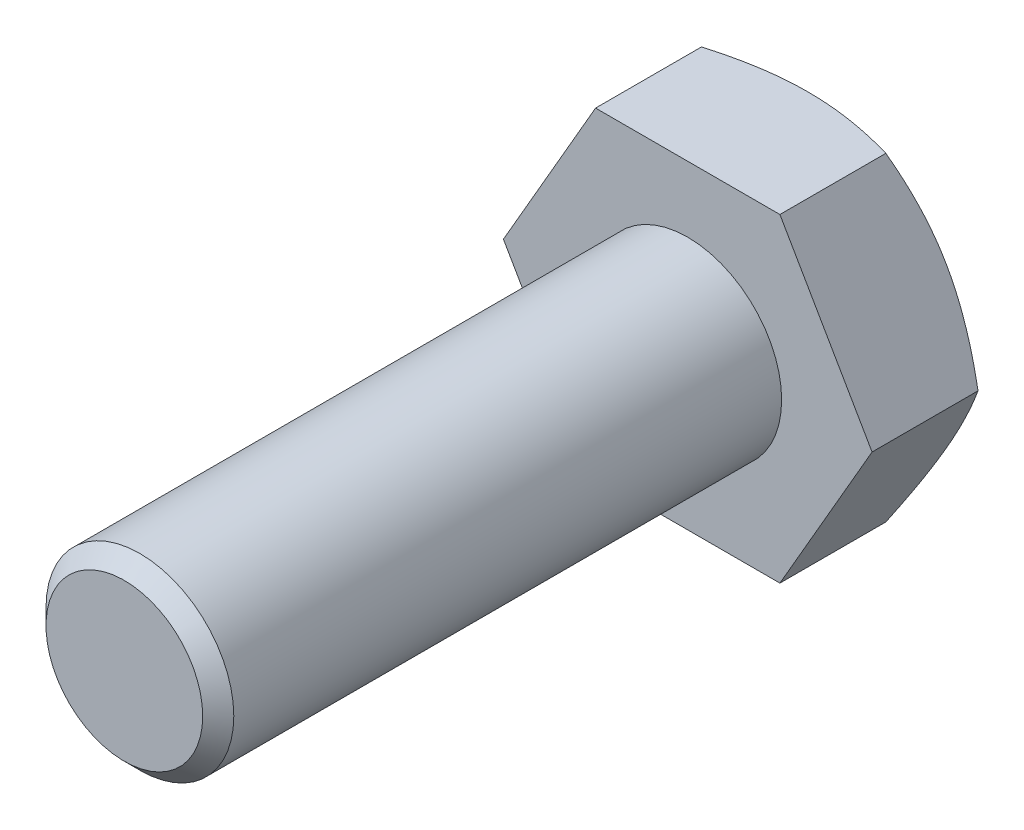
ISO-10303-21;
HEADER;
FILE_DESCRIPTION(('STEP AP214'),'2;1');
FILE_NAME('part.step','',(''),(''),'','','');
FILE_SCHEMA(('AUTOMOTIVE_DESIGN { 1 0 10303 214 1 1 1 1 }'));
ENDSEC;
DATA;
#1=APPLICATION_CONTEXT('core data for automotive mechanical design processes');
#2=APPLICATION_PROTOCOL_DEFINITION('international standard','automotive_design',2000,#1);
#3=PRODUCT_CONTEXT('',#1,'mechanical');
#4=PRODUCT('Part','Part','',(#3));
#5=PRODUCT_RELATED_PRODUCT_CATEGORY('part','',(#4));
#6=PRODUCT_DEFINITION_FORMATION('','',#4);
#7=PRODUCT_DEFINITION_CONTEXT('part definition',#1,'design');
#8=PRODUCT_DEFINITION('design','',#6,#7);
#9=PRODUCT_DEFINITION_SHAPE('','',#8);
#10=(LENGTH_UNIT() NAMED_UNIT(*) SI_UNIT(.MILLI.,.METRE.));
#11=(NAMED_UNIT(*) PLANE_ANGLE_UNIT() SI_UNIT($,.RADIAN.));
#12=(NAMED_UNIT(*) SI_UNIT($,.STERADIAN.) SOLID_ANGLE_UNIT());
#13=UNCERTAINTY_MEASURE_WITH_UNIT(LENGTH_MEASURE(1.E-05),#10,'distance_accuracy_value','');
#14=(GEOMETRIC_REPRESENTATION_CONTEXT(3) GLOBAL_UNCERTAINTY_ASSIGNED_CONTEXT((#13)) GLOBAL_UNIT_ASSIGNED_CONTEXT((#10,
#11,#12)) REPRESENTATION_CONTEXT('',''));
#15=CARTESIAN_POINT('',(0.,0.,0.));
#16=DIRECTION('',(0.,0.,1.));
#17=DIRECTION('',(1.,0.,0.));
#18=AXIS2_PLACEMENT_3D('',#15,#16,#17);
#19=CARTESIAN_POINT('',(4.90747728811212,8.50000000000016,6.40000000000099));
#20=DIRECTION('',(0.,-1.,0.));
#21=DIRECTION('',(1.,0.,0.));
#22=AXIS2_PLACEMENT_3D('',#19,#20,#21);
#23=PLANE('',#22);
#24=CARTESIAN_POINT('',(-13.1507760236535,8.50000000000042,4.13304094969343));
#25=CARTESIAN_POINT('',(-12.779793237213,8.50000000000025,3.9532071543903));
#26=CARTESIAN_POINT('',(-12.4079554817184,8.50000000000018,3.77510673530734));
#27=CARTESIAN_POINT('',(-11.6621152399988,8.50000000000014,3.42334814772755));
#28=CARTESIAN_POINT('',(-11.2881124210353,8.50000000000015,3.2496906855383));
#29=CARTESIAN_POINT('',(-10.5355451575032,8.50000000000017,2.90691310544452));
#30=CARTESIAN_POINT('',(-10.1569669433867,8.50000000000016,2.73782311333024));
#31=CARTESIAN_POINT('',(-9.39678859586902,8.50000000000016,2.40660460259513));
#32=CARTESIAN_POINT('',(-9.01518860718188,8.50000000000016,2.24447575296187));
#33=CARTESIAN_POINT('',(-8.23614945571322,8.50000000000016,1.92399544121883));
#34=CARTESIAN_POINT('',(-7.83859266315971,8.50000000000016,1.76592832975846));
#35=CARTESIAN_POINT('',(-7.03881729879112,8.50000000000016,1.46183316038925));
#36=CARTESIAN_POINT('',(-6.63659820785256,8.50000000000015,1.31580645809512));
#37=CARTESIAN_POINT('',(-5.82761654834246,8.50000000000017,1.03964910609802));
#38=CARTESIAN_POINT('',(-5.42086517952549,8.50000000000019,0.909486001850074));
#39=CARTESIAN_POINT('',(-4.60154260721254,8.50000000000012,0.669251504508218));
#40=CARTESIAN_POINT('',(-4.18897329126147,8.50000000000003,0.559173749551001));
#41=CARTESIAN_POINT('',(-3.36000334553182,8.50000000000004,0.365006336760554));
#42=CARTESIAN_POINT('',(-2.94363646849485,8.50000000000014,0.280776482057557));
#43=CARTESIAN_POINT('',(-2.31531966597736,8.50000000000017,0.177478094427576));
#44=CARTESIAN_POINT('',(-2.10523727732992,8.50000000000016,0.146884951462742));
#45=CARTESIAN_POINT('',(-1.68403896198439,8.50000000000016,0.0939815793612819));
#46=CARTESIAN_POINT('',(-1.47292313697842,8.50000000000016,0.0716705512133057));
#47=CARTESIAN_POINT('',(-1.05268457078276,8.50000000000016,0.0360540633783739));
#48=CARTESIAN_POINT('',(-0.84357143617689,8.50000000000016,0.022635693205803));
#49=CARTESIAN_POINT('',(-0.424965279960819,8.50000000000016,0.00465177528142398));
#50=CARTESIAN_POINT('',(-0.215472264664717,8.50000000000015,8.60817126390969E-05));
#51=CARTESIAN_POINT('',(0.203519347575902,8.50000000000017,-8.36556145530409E-05));
#52=CARTESIAN_POINT('',(0.413017944536883,8.50000000000019,0.00431233089848065));
#53=CARTESIAN_POINT('',(0.831644580776046,8.50000000000013,0.02195904630707));
#54=CARTESIAN_POINT('',(1.04077260074798,8.50000000000004,0.0352102236852546));
#55=CARTESIAN_POINT('',(1.54433660129013,8.5,0.0775002478253111));
#56=CARTESIAN_POINT('',(1.83842266660663,8.50000000000012,0.110794226410689));
#57=CARTESIAN_POINT('',(2.42437752012375,8.50000000000021,0.193069728584259));
#58=CARTESIAN_POINT('',(2.71624599731337,8.50000000000018,0.242053412505373));
#59=CARTESIAN_POINT('',(3.58821174297491,8.50000000000013,0.409938673399742));
#60=CARTESIAN_POINT('',(4.16433582674671,8.50000000000015,0.549742776936651));
#61=CARTESIAN_POINT('',(5.02572621394302,8.50000000000016,0.791736186856428));
#62=CARTESIAN_POINT('',(5.31547200535638,8.50000000000016,0.878893904538782));
#63=CARTESIAN_POINT('',(5.89214876364307,8.50000000000016,1.06215372096539));
#64=CARTESIAN_POINT('',(6.17907971225216,8.50000000000015,1.15825587770373));
#65=CARTESIAN_POINT('',(6.75021885398892,8.50000000000017,1.35787170131869));
#66=CARTESIAN_POINT('',(7.03442793558404,8.5000000000002,1.46138284929851));
#67=CARTESIAN_POINT('',(7.60049895914593,8.50000000000012,1.67460958247361));
#68=CARTESIAN_POINT('',(7.88236092581713,8.50000000000001,1.78432510227016));
#69=CARTESIAN_POINT('',(8.53585485546573,8.49999999999997,2.04566292007363));
#70=CARTESIAN_POINT('',(8.90669736291769,8.50000000000011,2.19925537736368));
#71=CARTESIAN_POINT('',(9.64531700349557,8.50000000000021,2.51366253411151));
#72=CARTESIAN_POINT('',(10.0130939638709,8.50000000000017,2.67447763736312));
#73=CARTESIAN_POINT('',(10.7461373790236,8.50000000000015,3.00191683409719));
#74=CARTESIAN_POINT('',(11.1114032983348,8.50000000000016,3.16854212322047));
#75=CARTESIAN_POINT('',(11.8397572222066,8.50000000000016,3.50645750747021));
#76=CARTESIAN_POINT('',(12.2028452686524,8.50000000000016,3.67774751253077));
#77=CARTESIAN_POINT('',(12.927570379847,8.50000000000016,4.02431621359802));
#78=CARTESIAN_POINT('',(13.2892055596489,8.50000000000016,4.19959884488746));
#79=CARTESIAN_POINT('',(14.0109318084844,8.50000000000016,4.55331757801335));
#80=CARTESIAN_POINT('',(14.3710228640548,8.50000000000016,4.73175370727584));
#81=CARTESIAN_POINT('',(15.4492515635062,8.50000000000016,5.27092611522304));
#82=CARTESIAN_POINT('',(16.1654350708762,8.50000000000016,5.6355699588705));
#83=CARTESIAN_POINT('',(17.5359569733251,8.50000000000016,6.34231107414496));
#84=CARTESIAN_POINT('',(18.1905930939243,8.50000000000016,6.68383353397369));
#85=CARTESIAN_POINT('',(19.4974088780933,8.50000000000016,7.37159446346647));
#86=CARTESIAN_POINT('',(20.1495884604161,8.50000000000016,7.71783308739354));
#87=CARTESIAN_POINT('',(21.4504717343125,8.50000000000017,8.41308553818056));
#88=CARTESIAN_POINT('',(22.0991800029719,8.50000000000018,8.76209081453515));
#89=CARTESIAN_POINT('',(23.3950185512495,8.50000000000015,9.46293857235101));
#90=CARTESIAN_POINT('',(24.0421489123185,8.50000000000011,9.81478090314648));
#91=CARTESIAN_POINT('',(24.6886951007935,8.50000000000001,10.1676862353782));
#92=B_SPLINE_CURVE_WITH_KNOTS('',3,(#24,#25,#26,#27,#28,#29,#30,#31,#32,#33,#34,#35,#36,#37,#38,
#39,#40,#41,#42,#43,#44,#45,#46,#47,#48,#49,#50,#51,#52,#53,#54,#55,#56,#57,#58,#59,#60,#61,#62,
#63,#64,#65,#66,#67,#68,#69,#70,#71,#72,#73,#74,#75,#76,#77,#78,#79,#80,#81,#82,#83,#84,#85,#86,
#87,#88,#89,#90,#91),.UNSPECIFIED.,.F.,.F.,(4,2,2,2,2,2,2,2,2,2,2,2,2,2,2,2,2,2,2,2,2,2,2,2,2,2,
2,2,2,2,2,2,2,4),(0.,1.23683205087273,2.47385951733026,3.71767475462567,4.96143078104728,
6.24476283372291,7.52823917842106,8.80904400127764,10.0894424332076,11.3627680683901,
11.9995252601113,12.6362210051439,13.2646692746335,13.8931071925414,14.521547233238,
15.1500191045082,16.0374110463139,16.9249252266627,18.7009540866881,19.608592151724,
20.5162361021263,21.4235729256431,22.33090018693,23.534971677628,24.7391105679074,
25.943498729742,27.1478636538281,28.3534719402871,29.5590907171106,31.9700274677016,
34.185108342642,36.4002618464375,38.6101511553736,40.8199238679679),.UNSPECIFIED.);
#93=CARTESIAN_POINT('',(-4.90747728811173,8.50000000000008,0.759189378557144));
#94=VERTEX_POINT('',#93);
#95=CARTESIAN_POINT('',(6.76542155630955E-13,8.49999999999981,-2.35922392732846E-13));
#96=VERTEX_POINT('',#95);
#97=EDGE_CURVE('E65',#94,#96,#92,.T.);
#98=ORIENTED_EDGE('',*,*,#97,.F.);
#99=DIRECTION('',(0.,0.,-1.));
#100=VECTOR('',#99,1.);
#101=CARTESIAN_POINT('',(-4.90747728811163,8.5000000000003,6.40000000000229));
#102=LINE('',#101,#100);
#103=CARTESIAN_POINT('',(-4.90747728811163,8.5000000000003,6.40000000000229));
#104=VERTEX_POINT('',#103);
#105=EDGE_CURVE('E164',#104,#94,#102,.T.);
#106=ORIENTED_EDGE('',*,*,#105,.F.);
#107=DIRECTION('',(-1.,0.,0.));
#108=VECTOR('',#107,1.);
#109=CARTESIAN_POINT('',(4.90747728811212,8.50000000000016,6.40000000000099));
#110=LINE('',#109,#108);
#111=CARTESIAN_POINT('',(4.90747728811212,8.50000000000016,6.40000000000099));
#112=VERTEX_POINT('',#111);
#113=EDGE_CURVE('E262',#112,#104,#110,.T.);
#114=ORIENTED_EDGE('',*,*,#113,.F.);
#115=DIRECTION('',(0.,0.,-1.));
#116=VECTOR('',#115,1.);
#117=CARTESIAN_POINT('',(4.90747728811212,8.50000000000016,6.40000000000099));
#118=LINE('',#117,#116);
#119=CARTESIAN_POINT('',(4.90747728811194,8.50000000000005,0.75918937855584));
#120=VERTEX_POINT('',#119);
#121=EDGE_CURVE('E151',#112,#120,#118,.T.);
#122=ORIENTED_EDGE('',*,*,#121,.T.);
#123=EDGE_CURVE('E145',#96,#120,#92,.T.);
#124=ORIENTED_EDGE('',*,*,#123,.F.);
#125=EDGE_LOOP('',(#98,#106,#114,#122,#124));
#126=FACE_BOUND('',#125,.T.);
#127=ADVANCED_FACE('F50',(#126),#23,.F.);
#128=CARTESIAN_POINT('',(-4.90747728811163,8.5000000000003,6.40000000000229));
#129=DIRECTION('',(0.866025403784439,-0.5,0.));
#130=DIRECTION('',(0.5,0.866025403784439,0.));
#131=AXIS2_PLACEMENT_3D('',#128,#129,#130);
#132=PLANE('',#131);
#133=CARTESIAN_POINT('',(-9.81507004627735,-0.000199999999977996,0.759256046397982));
#134=CARTESIAN_POINT('',(-9.70719836791424,0.186639227622768,0.696986139248973));
#135=CARTESIAN_POINT('',(-9.59892450580097,0.374175057934708,0.6375422957474));
#136=CARTESIAN_POINT('',(-9.38149745632211,0.750769754571919,0.52508511076032));
#137=CARTESIAN_POINT('',(-9.27234391091486,0.939829241043536,0.472074544983142));
#138=CARTESIAN_POINT('',(-8.94313560188241,1.51003475856155,0.323733389730519));
#139=CARTESIAN_POINT('',(-8.72178130831629,1.8934316414916,0.239358927937871));
#140=CARTESIAN_POINT('',(-8.39052888726984,2.46717766487425,0.140420015694828));
#141=CARTESIAN_POINT('',(-8.28162036184627,2.65581276428527,0.112235199448259));
#142=CARTESIAN_POINT('',(-8.06331079760512,3.03393602132919,0.0649740847663061));
#143=CARTESIAN_POINT('',(-7.95390980316582,3.22342410209662,0.0458969815531207));
#144=CARTESIAN_POINT('',(-7.73491944569814,3.60272652759828,0.0173347726658145));
#145=CARTESIAN_POINT('',(-7.62533043846194,3.79254025608237,0.00783878147114015));
#146=CARTESIAN_POINT('',(-7.4060511905215,4.17234305456082,-0.00135762036058392));
#147=CARTESIAN_POINT('',(-7.29636095304958,4.36233211895666,-0.00105833363161793));
#148=CARTESIAN_POINT('',(-7.09129139581003,4.7175230111812,0.00865447557452116));
#149=CARTESIAN_POINT('',(-6.9958976040627,4.88274990521406,0.0168831685979087));
#150=CARTESIAN_POINT('',(-6.80533344342264,5.21281671354424,0.0405892410567572));
#151=CARTESIAN_POINT('',(-6.7101630900253,5.37765660100275,0.0560671091188197));
#152=CARTESIAN_POINT('',(-6.4250204732264,5.87153810070166,0.113008620858951));
#153=CARTESIAN_POINT('',(-6.23555293555783,6.19970550232856,0.164973061277844));
#154=CARTESIAN_POINT('',(-5.85460803351865,6.85952142754474,0.29488494052299));
#155=CARTESIAN_POINT('',(-5.66317928714386,7.1910857422951,0.373383069871971));
#156=CARTESIAN_POINT('',(-5.28317649029198,7.84926989346085,0.551541339973035));
#157=CARTESIAN_POINT('',(-5.0945975735863,8.1758981584314,0.651159636130974));
#158=CARTESIAN_POINT('',(-4.90736181805794,8.50020000000008,0.759256046400265));
#159=B_SPLINE_CURVE_WITH_KNOTS('',3,(#133,#134,#135,#136,#137,#138,#139,#140,#141,#142,#143,
#144,#145,#146,#147,#148,#149,#150,#151,#152,#153,#154,#155,#156,#157,#158),.UNSPECIFIED.,.F.,
.F.,(4,2,2,2,2,2,2,2,2,2,2,2,4),(0.,0.673596396411569,1.34748239783853,2.69805431639328,
3.356799954547,4.01548737369112,4.67342558367778,5.33134346608664,5.90409556798859,
6.47688628148388,7.62328361419594,8.79510569878617,9.96462743748781),.UNSPECIFIED.);
#160=CARTESIAN_POINT('',(-9.81495457622353,1.2490009027033E-13,0.759189378554861));
#161=VERTEX_POINT('',#160);
#162=CARTESIAN_POINT('',(-7.36121593216766,4.25000000000007,1.06165076729781E-12));
#163=VERTEX_POINT('',#162);
#164=EDGE_CURVE('E73',#161,#163,#159,.T.);
#165=ORIENTED_EDGE('',*,*,#164,.F.);
#166=DIRECTION('',(0.,0.,-1.));
#167=VECTOR('',#166,1.);
#168=CARTESIAN_POINT('',(-9.81495457622254,1.04083408558608E-12,6.40000000000001));
#169=LINE('',#168,#167);
#170=CARTESIAN_POINT('',(-9.81495457622254,1.04083408558608E-12,6.40000000000001));
#171=VERTEX_POINT('',#170);
#172=EDGE_CURVE('E161',#171,#161,#169,.T.);
#173=ORIENTED_EDGE('',*,*,#172,.F.);
#174=DIRECTION('',(-0.5,-0.866025403784439,0.));
#175=VECTOR('',#174,1.);
#176=CARTESIAN_POINT('',(-4.90747728811163,8.5000000000003,6.40000000000229));
#177=LINE('',#176,#175);
#178=EDGE_CURVE('E257',#104,#171,#177,.T.);
#179=ORIENTED_EDGE('',*,*,#178,.F.);
#180=ORIENTED_EDGE('',*,*,#105,.T.);
#181=EDGE_CURVE('E199',#163,#94,#159,.T.);
#182=ORIENTED_EDGE('',*,*,#181,.F.);
#183=EDGE_LOOP('',(#165,#173,#179,#180,#182));
#184=FACE_BOUND('',#183,.T.);
#185=ADVANCED_FACE('F241',(#184),#132,.F.);
#186=CARTESIAN_POINT('',(-9.81495457622254,1.04083408558608E-12,6.40000000000001));
#187=DIRECTION('',(0.866025403784439,0.5,0.));
#188=DIRECTION('',(-0.5,0.866025403784439,0.));
#189=AXIS2_PLACEMENT_3D('',#186,#187,#188);
#190=PLANE('',#189);
#191=CARTESIAN_POINT('',(-4.90736181805806,-8.50020000000003,0.759256046396678));
#192=CARTESIAN_POINT('',(-5.0152334964204,-8.31336077237677,0.696986139247987));
#193=CARTESIAN_POINT('',(-5.12350735853333,-8.12582494206463,0.63754229574655));
#194=CARTESIAN_POINT('',(-5.34093440801192,-7.74923024542729,0.525085110759573));
#195=CARTESIAN_POINT('',(-5.45008795341923,-7.56017075895575,0.472074544982361));
#196=CARTESIAN_POINT('',(-5.77929626245179,-6.98996524143787,0.323733389729677));
#197=CARTESIAN_POINT('',(-6.00065055601784,-6.6065683585078,0.239358927937049));
#198=CARTESIAN_POINT('',(-6.33190297706423,-6.03282233512513,0.140420015694009));
#199=CARTESIAN_POINT('',(-6.44081150248778,-5.84418723571411,0.112235199447437));
#200=CARTESIAN_POINT('',(-6.659121066729,-5.46606397867023,0.0649740847654669));
#201=CARTESIAN_POINT('',(-6.76852206116836,-5.27657589790284,0.0458969815522681));
#202=CARTESIAN_POINT('',(-6.98751241863584,-4.89727347240108,0.0173347726649909));
#203=CARTESIAN_POINT('',(-7.09710142587176,-4.70745974391684,0.00783878147035882));
#204=CARTESIAN_POINT('',(-7.31638067381293,-4.32765694543884,-0.00135762036148689));
#205=CARTESIAN_POINT('',(-7.42607091128587,-4.1376678810436,-0.00105833363268497));
#206=CARTESIAN_POINT('',(-7.63114046852526,-3.782476988819,0.00865447557347719));
#207=CARTESIAN_POINT('',(-7.72653426027168,-3.61725009478563,0.0168831685970092));
#208=CARTESIAN_POINT('',(-7.91709842091104,-3.28718328645507,0.0405892410559698));
#209=CARTESIAN_POINT('',(-8.0122687743086,-3.12234339899669,0.0560671091180001));
#210=CARTESIAN_POINT('',(-8.29741139110786,-2.628461899298,0.113008620858069));
#211=CARTESIAN_POINT('',(-8.48687892877629,-2.30029449767101,0.164973061276965));
#212=CARTESIAN_POINT('',(-8.86782383081525,-1.64047857245475,0.294884940522219));
#213=CARTESIAN_POINT('',(-9.05925257718998,-1.3089142577044,0.373383069871305));
#214=CARTESIAN_POINT('',(-9.43925537404215,-0.650730106538796,0.551541339972081));
#215=CARTESIAN_POINT('',(-9.62783429074818,-0.324101841568382,0.651159636129626));
#216=CARTESIAN_POINT('',(-9.81507004627729,0.000200000000102896,0.759256046397982));
#217=B_SPLINE_CURVE_WITH_KNOTS('',3,(#191,#192,#193,#194,#195,#196,#197,#198,#199,#200,#201,
#202,#203,#204,#205,#206,#207,#208,#209,#210,#211,#212,#213,#214,#215,#216),.UNSPECIFIED.,.F.,
.F.,(4,2,2,2,2,2,2,2,2,2,2,2,4),(0.,0.673596396411488,1.34748239783838,2.69805431639306,
3.35679995454677,4.01548737369089,4.67342558367751,5.33134346608634,5.90409556798826,
6.47688628148353,7.62328361419559,8.79510569878577,9.96462743748729),.UNSPECIFIED.);
#218=CARTESIAN_POINT('',(-4.90747728811185,-8.49999999999997,0.759189378553557));
#219=VERTEX_POINT('',#218);
#220=CARTESIAN_POINT('',(-7.36121593216775,-4.24999999999999,-2.28289609438548E-12));
#221=VERTEX_POINT('',#220);
#222=EDGE_CURVE('E197',#219,#221,#217,.T.);
#223=ORIENTED_EDGE('',*,*,#222,.F.);
#224=DIRECTION('',(0.,0.,-1.));
#225=VECTOR('',#224,1.);
#226=CARTESIAN_POINT('',(-4.90747728811145,-8.49999999999985,6.39999999999871));
#227=LINE('',#226,#225);
#228=CARTESIAN_POINT('',(-4.90747728811145,-8.49999999999985,6.39999999999871));
#229=VERTEX_POINT('',#228);
#230=EDGE_CURVE('E153',#229,#219,#227,.T.);
#231=ORIENTED_EDGE('',*,*,#230,.F.);
#232=DIRECTION('',(0.5,-0.866025403784439,0.));
#233=VECTOR('',#232,1.);
#234=CARTESIAN_POINT('',(-9.81495457622254,1.04083408558608E-12,6.40000000000001));
#235=LINE('',#234,#233);
#236=EDGE_CURVE('E261',#171,#229,#235,.T.);
#237=ORIENTED_EDGE('',*,*,#236,.F.);
#238=ORIENTED_EDGE('',*,*,#172,.T.);
#239=EDGE_CURVE('E195',#221,#161,#217,.T.);
#240=ORIENTED_EDGE('',*,*,#239,.F.);
#241=EDGE_LOOP('',(#223,#231,#237,#238,#240));
#242=FACE_BOUND('',#241,.T.);
#243=ADVANCED_FACE('F244',(#242),#190,.F.);
#244=CARTESIAN_POINT('',(-4.90747728811145,-8.49999999999985,6.39999999999871));
#245=DIRECTION('',(0.,1.,0.));
#246=DIRECTION('',(0.,0.,1.));
#247=AXIS2_PLACEMENT_3D('',#244,#245,#246);
#248=PLANE('',#247);
#249=CARTESIAN_POINT('',(-13.1507760236543,-8.49999999999936,4.13304094969467));
#250=CARTESIAN_POINT('',(-12.7797932372139,-8.49999999999968,3.95320715439099));
#251=CARTESIAN_POINT('',(-12.4079554817194,-8.49999999999981,3.77510673530777));
#252=CARTESIAN_POINT('',(-11.6621152399996,-8.4999999999999,3.4233481477277));
#253=CARTESIAN_POINT('',(-11.2881124210359,-8.49999999999987,3.24969068553842));
#254=CARTESIAN_POINT('',(-10.5355451575034,-8.49999999999984,2.9069131054445));
#255=CARTESIAN_POINT('',(-10.1569669433866,-8.49999999999985,2.73782311333009));
#256=CARTESIAN_POINT('',(-9.39678859586843,-8.49999999999986,2.40660460259475));
#257=CARTESIAN_POINT('',(-9.01518860718106,-8.49999999999986,2.24447575296138));
#258=CARTESIAN_POINT('',(-8.23614945571216,-8.49999999999985,1.9239954412183));
#259=CARTESIAN_POINT('',(-7.83859266315865,-8.49999999999985,1.76592832975798));
#260=CARTESIAN_POINT('',(-7.03881729879006,-8.49999999999986,1.46183316038866));
#261=CARTESIAN_POINT('',(-6.63659820785151,-8.49999999999987,1.31580645809436));
#262=CARTESIAN_POINT('',(-5.82761654834131,-8.49999999999984,1.03964910609775));
#263=CARTESIAN_POINT('',(-5.42086517952422,-8.49999999999981,0.909486001850435));
#264=CARTESIAN_POINT('',(-4.60154260721184,-8.4999999999999,0.66925150450698));
#265=CARTESIAN_POINT('',(-4.18897329126146,-8.50000000000003,0.559173749547522));
#266=CARTESIAN_POINT('',(-3.36000334553208,-8.50000000000002,0.36500633675733));
#267=CARTESIAN_POINT('',(-2.94363646849471,-8.49999999999988,0.2807764820568));
#268=CARTESIAN_POINT('',(-2.31531966597719,-8.49999999999984,0.177478094427663));
#269=CARTESIAN_POINT('',(-2.10523727732982,-8.49999999999985,0.146884951462633));
#270=CARTESIAN_POINT('',(-1.6840389619844,-8.49999999999986,0.0939815793610365));
#271=CARTESIAN_POINT('',(-1.47292313697847,-8.49999999999986,0.07167055121312));
#272=CARTESIAN_POINT('',(-1.05268457078284,-8.49999999999985,0.0360540633782233));
#273=CARTESIAN_POINT('',(-0.843571436176969,-8.49999999999985,0.022635693205631));
#274=CARTESIAN_POINT('',(-0.424965279960885,-8.49999999999985,0.00465177528125188));
#275=CARTESIAN_POINT('',(-0.215472264664773,-8.49999999999986,8.60817124886621E-05));
#276=CARTESIAN_POINT('',(0.20351934757585,-8.49999999999985,-8.36556147549394E-05));
#277=CARTESIAN_POINT('',(0.413017944536824,-8.49999999999985,0.00431233089820466));
#278=CARTESIAN_POINT('',(0.831644580775958,-8.49999999999986,0.0219590463069869));
#279=CARTESIAN_POINT('',(1.04077260074787,-8.49999999999988,0.0352102236854389));
#280=CARTESIAN_POINT('',(1.54433660128999,-8.49999999999989,0.0775002478256187));
#281=CARTESIAN_POINT('',(1.8384226666065,-8.49999999999986,0.110794226410637));
#282=CARTESIAN_POINT('',(2.42437752012361,-8.49999999999985,0.193069728583933));
#283=CARTESIAN_POINT('',(2.7162459973132,-8.49999999999985,0.242053412505133));
#284=CARTESIAN_POINT('',(3.5882117429747,-8.49999999999986,0.409938673399622));
#285=CARTESIAN_POINT('',(4.16433582674652,-8.49999999999986,0.549742776936426));
#286=CARTESIAN_POINT('',(5.02572621394272,-8.49999999999985,0.791736186856201));
#287=CARTESIAN_POINT('',(5.31547200535599,-8.49999999999985,0.878893904538567));
#288=CARTESIAN_POINT('',(5.89214876364257,-8.49999999999986,1.06215372096503));
#289=CARTESIAN_POINT('',(6.17907971225164,-8.49999999999986,1.15825587770321));
#290=CARTESIAN_POINT('',(6.75021885398811,-8.49999999999984,1.35787170131846));
#291=CARTESIAN_POINT('',(7.03442793558296,-8.49999999999982,1.46138284929873));
#292=CARTESIAN_POINT('',(7.60049895914519,-8.49999999999989,1.67460958247244));
#293=CARTESIAN_POINT('',(7.882360925817,-8.49999999999999,1.78432510226713));
#294=CARTESIAN_POINT('',(8.53585485546559,-8.50000000000003,2.04566292006981));
#295=CARTESIAN_POINT('',(8.90669736291647,-8.4999999999999,2.19925537736207));
#296=CARTESIAN_POINT('',(9.64531700349338,-8.49999999999981,2.51366253411144));
#297=CARTESIAN_POINT('',(10.0130939638688,-8.49999999999984,2.67447763736236));
#298=CARTESIAN_POINT('',(10.7461373790215,-8.49999999999987,3.00191683409587));
#299=CARTESIAN_POINT('',(11.1114032983325,-8.49999999999986,3.16854212321925));
#300=CARTESIAN_POINT('',(11.839757222204,-8.49999999999985,3.506457507469));
#301=CARTESIAN_POINT('',(12.2028452686498,-8.49999999999985,3.67774751252946));
#302=CARTESIAN_POINT('',(12.9275703798443,-8.49999999999986,4.02431621359656));
#303=CARTESIAN_POINT('',(13.289205559646,-8.49999999999985,4.19959884488596));
#304=CARTESIAN_POINT('',(14.0109318084813,-8.49999999999985,4.55331757801177));
#305=CARTESIAN_POINT('',(14.3710228640517,-8.49999999999985,4.7317537072742));
#306=CARTESIAN_POINT('',(15.4492515635028,-8.49999999999985,5.27092611522125));
#307=CARTESIAN_POINT('',(16.1654350708727,-8.49999999999985,5.63556995886861));
#308=CARTESIAN_POINT('',(17.5359569733217,-8.49999999999985,6.34231107414309));
#309=CARTESIAN_POINT('',(18.1905930939212,-8.49999999999985,6.68383353397195));
#310=CARTESIAN_POINT('',(19.4974088780907,-8.49999999999985,7.371594463465));
#311=CARTESIAN_POINT('',(20.1495884604137,-8.49999999999985,7.71783308739222));
#312=CARTESIAN_POINT('',(21.4504717343106,-8.49999999999985,8.4130855381795));
#313=CARTESIAN_POINT('',(22.0991800029702,-8.49999999999986,8.76209081453421));
#314=CARTESIAN_POINT('',(23.3950185512482,-8.49999999999985,9.46293857235025));
#315=CARTESIAN_POINT('',(24.0421489123174,-8.49999999999984,9.81478090314579));
#316=CARTESIAN_POINT('',(24.6886951007927,-8.49999999999983,10.1676862353776));
#317=B_SPLINE_CURVE_WITH_KNOTS('',3,(#249,#250,#251,#252,#253,#254,#255,#256,#257,#258,#259,
#260,#261,#262,#263,#264,#265,#266,#267,#268,#269,#270,#271,#272,#273,#274,#275,#276,#277,#278,
#279,#280,#281,#282,#283,#284,#285,#286,#287,#288,#289,#290,#291,#292,#293,#294,#295,#296,#297,
#298,#299,#300,#301,#302,#303,#304,#305,#306,#307,#308,#309,#310,#311,#312,#313,#314,#315,#316),
.UNSPECIFIED.,.F.,.F.,(4,2,2,2,2,2,2,2,2,2,2,2,2,2,2,2,2,2,2,2,2,2,2,2,2,2,2,2,2,2,2,2,2,4),(0.,
1.23683205087315,2.47385951733116,3.71767475462741,4.96143078104979,6.24476283372538,
7.52823917842362,8.80904400128006,10.0894424332096,11.3627680683918,11.9995252601129,
12.6362210051453,13.264669274635,13.893107192543,14.5215472332395,15.1500191045097,
16.0374110463153,16.924925226664,18.7009540866894,19.6085921517251,20.5162361021271,
21.4235729256437,22.3309001869302,23.5349716776277,24.7391105679067,25.943498729741,
27.1478636538267,28.3534719402855,29.5590907171086,31.970027467699,34.1851083426403,
36.4002618464367,38.6101511553735,40.8199238679686),.UNSPECIFIED.);
#318=CARTESIAN_POINT('',(4.90747728811193,-8.49999999999998,0.759189378552572));
#319=VERTEX_POINT('',#318);
#320=CARTESIAN_POINT('',(0.,-8.49999999999997,0.));
#321=VERTEX_POINT('',#320);
#322=EDGE_CURVE('E183',#319,#321,#317,.F.);
#323=ORIENTED_EDGE('',*,*,#322,.F.);
#324=DIRECTION('',(0.,0.,-1.));
#325=VECTOR('',#324,1.);
#326=CARTESIAN_POINT('',(4.90747728811284,-8.49999999999969,6.39999999999772));
#327=LINE('',#326,#325);
#328=CARTESIAN_POINT('',(4.90747728811284,-8.49999999999969,6.39999999999772));
#329=VERTEX_POINT('',#328);
#330=EDGE_CURVE('E150',#329,#319,#327,.T.);
#331=ORIENTED_EDGE('',*,*,#330,.F.);
#332=DIRECTION('',(1.,0.,0.));
#333=VECTOR('',#332,1.);
#334=CARTESIAN_POINT('',(-4.90747728811145,-8.49999999999985,6.39999999999871));
#335=LINE('',#334,#333);
#336=EDGE_CURVE('E270',#229,#329,#335,.T.);
#337=ORIENTED_EDGE('',*,*,#336,.F.);
#338=ORIENTED_EDGE('',*,*,#230,.T.);
#339=EDGE_CURVE('E189',#321,#219,#317,.F.);
#340=ORIENTED_EDGE('',*,*,#339,.F.);
#341=EDGE_LOOP('',(#323,#331,#337,#338,#340));
#342=FACE_BOUND('',#341,.T.);
#343=ADVANCED_FACE('F190',(#342),#248,.F.);
#344=CARTESIAN_POINT('',(4.90747728811284,-8.49999999999969,6.39999999999772));
#345=DIRECTION('',(-0.866025403784439,0.5,0.));
#346=DIRECTION('',(-0.5,-0.866025403784439,0.));
#347=AXIS2_PLACEMENT_3D('',#344,#345,#346);
#348=PLANE('',#347);
#349=CARTESIAN_POINT('',(9.81507004627752,0.000200000000019629,0.759256046397982));
#350=CARTESIAN_POINT('',(9.70719836791475,-0.186639227622907,0.696986139249092));
#351=CARTESIAN_POINT('',(9.59892450580164,-0.3741750579349,0.63754229574758));
#352=CARTESIAN_POINT('',(9.38149745632292,-0.750769754572108,0.525085110760563));
#353=CARTESIAN_POINT('',(9.27234391091566,-0.939829241043666,0.472074544983387));
#354=CARTESIAN_POINT('',(8.94313560188315,-1.51003475856166,0.323733389730733));
#355=CARTESIAN_POINT('',(8.72178130831702,-1.89343164149178,0.23935892793806));
#356=CARTESIAN_POINT('',(8.39052888727055,-2.46717766487452,0.14042001569506));
#357=CARTESIAN_POINT('',(8.28162036184698,-2.65581276428556,0.112235199448519));
#358=CARTESIAN_POINT('',(8.06331079760578,-3.03393602132949,0.0649740847664824));
#359=CARTESIAN_POINT('',(7.95390980316644,-3.22342410209691,0.0458969815531857));
#360=CARTESIAN_POINT('',(7.73491944569887,-3.60272652759862,0.0173347726661967));
#361=CARTESIAN_POINT('',(7.62533043846281,-3.79254025608276,0.00783878147194951));
#362=CARTESIAN_POINT('',(7.40605119052204,-4.17234305456096,-0.00135762036093067));
#363=CARTESIAN_POINT('',(7.29636095304964,-4.36233211895649,-0.00105833363354916));
#364=CARTESIAN_POINT('',(7.09129139581024,-4.71752301118092,0.0086544755728138));
#365=CARTESIAN_POINT('',(6.99589760406341,-4.88274990521393,0.0168831685975954));
#366=CARTESIAN_POINT('',(6.80533344342376,-5.21281671354416,0.0405892410574901));
#367=CARTESIAN_POINT('',(6.71016309002634,-5.37765660100258,0.0560671091192059));
#368=CARTESIAN_POINT('',(6.42502047322729,-5.87153810070132,0.113008620858721));
#369=CARTESIAN_POINT('',(6.23555293555882,-6.19970550232823,0.164973061277766));
#370=CARTESIAN_POINT('',(5.8546080335198,-6.85952142754435,0.2948849405233));
#371=CARTESIAN_POINT('',(5.66317928714507,-7.19108574229462,0.373383069872517));
#372=CARTESIAN_POINT('',(5.28317649029305,-7.84926989346034,0.551541339972543));
#373=CARTESIAN_POINT('',(5.09459757358716,-8.17589815843095,0.651159636129201));
#374=CARTESIAN_POINT('',(4.90736181805826,-8.5002,0.759256046395693));
#375=B_SPLINE_CURVE_WITH_KNOTS('',3,(#349,#350,#351,#352,#353,#354,#355,#356,#357,#358,#359,
#360,#361,#362,#363,#364,#365,#366,#367,#368,#369,#370,#371,#372,#373,#374),.UNSPECIFIED.,.F.,
.F.,(4,2,2,2,2,2,2,2,2,2,2,2,4),(0.,0.673596396411428,1.34748239783827,2.69805431639321,
3.35679995454698,4.01548737369113,4.67342558367774,5.33134346608646,5.90409556798816,
6.47688628148332,7.62328361419523,8.79510569878536,9.96462743748651),.UNSPECIFIED.);
#376=CARTESIAN_POINT('',(9.81495457622371,0.,0.759189378554854));
#377=VERTEX_POINT('',#376);
#378=CARTESIAN_POINT('',(7.36121593216782,-4.25000000000002,-7.42461647718073E-13));
#379=VERTEX_POINT('',#378);
#380=EDGE_CURVE('E126',#377,#379,#375,.T.);
#381=ORIENTED_EDGE('',*,*,#380,.F.);
#382=DIRECTION('',(0.,0.,-1.));
#383=VECTOR('',#382,1.);
#384=CARTESIAN_POINT('',(9.814954576224,1.52655665885959E-13,6.4));
#385=LINE('',#384,#383);
#386=CARTESIAN_POINT('',(9.814954576224,1.52655665885959E-13,6.4));
#387=VERTEX_POINT('',#386);
#388=EDGE_CURVE('E141',#387,#377,#385,.T.);
#389=ORIENTED_EDGE('',*,*,#388,.F.);
#390=DIRECTION('',(0.5,0.866025403784439,0.));
#391=VECTOR('',#390,1.);
#392=CARTESIAN_POINT('',(4.90747728811284,-8.49999999999969,6.39999999999772));
#393=LINE('',#392,#391);
#394=EDGE_CURVE('E272',#329,#387,#393,.T.);
#395=ORIENTED_EDGE('',*,*,#394,.F.);
#396=ORIENTED_EDGE('',*,*,#330,.T.);
#397=EDGE_CURVE('E144',#379,#319,#375,.T.);
#398=ORIENTED_EDGE('',*,*,#397,.F.);
#399=EDGE_LOOP('',(#381,#389,#395,#396,#398));
#400=FACE_BOUND('',#399,.T.);
#401=ADVANCED_FACE('F139',(#400),#348,.F.);
#402=CARTESIAN_POINT('',(9.814954576224,1.52655665885959E-13,6.4));
#403=DIRECTION('',(-0.866025403784439,-0.5,0.));
#404=DIRECTION('',(0.5,-0.866025403784439,0.));
#405=AXIS2_PLACEMENT_3D('',#402,#403,#404);
#406=PLANE('',#405);
#407=CARTESIAN_POINT('',(4.90736181805809,8.50020000000005,0.759256046398968));
#408=CARTESIAN_POINT('',(5.01523349642132,8.31336077237755,0.696986139249411));
#409=CARTESIAN_POINT('',(5.12350735853464,8.12582494206572,0.637542295747607));
#410=CARTESIAN_POINT('',(5.34093440801354,7.74923024542859,0.525085110760351));
#411=CARTESIAN_POINT('',(5.45008795342077,7.56017075895695,0.472074544983228));
#412=CARTESIAN_POINT('',(5.77929626245323,6.98996524143884,0.323733389730666));
#413=CARTESIAN_POINT('',(6.0006505560194,6.60656835850877,0.239358927937939));
#414=CARTESIAN_POINT('',(6.33190297706589,6.03282233512604,0.140420015694887));
#415=CARTESIAN_POINT('',(6.44081150248945,5.844187235715,0.112235199448334));
#416=CARTESIAN_POINT('',(6.65912106673064,5.46606397867107,0.064974084766332));
#417=CARTESIAN_POINT('',(6.76852206116997,5.27657589790365,0.0458969815530828));
#418=CARTESIAN_POINT('',(6.98751241863758,4.89727347240194,0.017334772665941));
#419=CARTESIAN_POINT('',(7.09710142587368,4.70745974391779,0.00783878147149443));
#420=CARTESIAN_POINT('',(7.31638067381439,4.32765694543952,-0.00135762036085144));
#421=CARTESIAN_POINT('',(7.42607091128669,4.13766788104391,-0.00105833363273562));
#422=CARTESIAN_POINT('',(7.63114046852615,3.78247698881941,0.00865447557352067));
#423=CARTESIAN_POINT('',(7.7265342602731,3.6172500947864,0.0168831685976535));
#424=CARTESIAN_POINT('',(7.91709842091286,3.28718328645614,0.0405892410570602));
#425=CARTESIAN_POINT('',(8.01226877431028,3.12234339899769,0.0560671091189363));
#426=CARTESIAN_POINT('',(8.2974113911093,2.6284618992989,0.113008620858738));
#427=CARTESIAN_POINT('',(8.48687892877778,2.30029449767197,0.164973061277717));
#428=CARTESIAN_POINT('',(8.8678238308169,1.64047857245581,0.294884940523062));
#429=CARTESIAN_POINT('',(9.0592525771917,1.30891425770551,0.373383069872156));
#430=CARTESIAN_POINT('',(9.43925537404358,0.650730106539695,0.551541339972717));
#431=CARTESIAN_POINT('',(9.62783429074923,0.32410184156903,0.651159636130037));
#432=CARTESIAN_POINT('',(9.81507004627752,-0.000200000000033507,0.759256046397982));
#433=B_SPLINE_CURVE_WITH_KNOTS('',3,(#407,#408,#409,#410,#411,#412,#413,#414,#415,#416,#417,
#418,#419,#420,#421,#422,#423,#424,#425,#426,#427,#428,#429,#430,#431,#432),.UNSPECIFIED.,.F.,
.F.,(4,2,2,2,2,2,2,2,2,2,2,2,4),(0.,0.673596396411571,1.34748239783853,2.69805431639347,
3.35679995454724,4.01548737369139,4.67342558367804,5.33134346608686,5.90409556798868,
6.47688628148391,7.62328361419589,8.79510569878611,9.96462743748756),.UNSPECIFIED.);
#434=CARTESIAN_POINT('',(7.36121593216878,4.25000000000023,2.29677388219329E-12));
#435=VERTEX_POINT('',#434);
#436=EDGE_CURVE('E133',#120,#435,#433,.T.);
#437=ORIENTED_EDGE('',*,*,#436,.F.);
#438=ORIENTED_EDGE('',*,*,#121,.F.);
#439=DIRECTION('',(-0.5,0.86602540378444,0.));
#440=VECTOR('',#439,1.);
#441=CARTESIAN_POINT('',(9.814954576224,1.52655665885959E-13,6.4));
#442=LINE('',#441,#440);
#443=EDGE_CURVE('E149',#387,#112,#442,.T.);
#444=ORIENTED_EDGE('',*,*,#443,.F.);
#445=ORIENTED_EDGE('',*,*,#388,.T.);
#446=EDGE_CURVE('E123',#435,#377,#433,.T.);
#447=ORIENTED_EDGE('',*,*,#446,.F.);
#448=EDGE_LOOP('',(#437,#438,#444,#445,#447));
#449=FACE_BOUND('',#448,.T.);
#450=ADVANCED_FACE('F147',(#449),#406,.F.);
#451=CARTESIAN_POINT('',(2.15105711021124E-13,1.66533453693773E-13,6.4));
#452=DIRECTION('',(0.,0.,1.));
#453=DIRECTION('',(1.,0.,0.));
#454=AXIS2_PLACEMENT_3D('',#451,#452,#453);
#455=PLANE('',#454);
#456=CARTESIAN_POINT('',(2.15105711021124E-13,1.66533453693773E-13,6.4));
#457=DIRECTION('',(0.,0.,1.));
#458=DIRECTION('',(1.,0.,0.));
#459=AXIS2_PLACEMENT_3D('',#456,#457,#458);
#460=CIRCLE('',#459,5.);
#461=CARTESIAN_POINT('',(5.00000000000021,1.66533453693773E-13,6.4));
#462=VERTEX_POINT('',#461);
#463=EDGE_CURVE('E265',#462,#462,#460,.T.);
#464=ORIENTED_EDGE('',*,*,#463,.F.);
#465=EDGE_LOOP('',(#464));
#466=FACE_BOUND('',#465,.T.);
#467=ORIENTED_EDGE('',*,*,#113,.T.);
#468=ORIENTED_EDGE('',*,*,#178,.T.);
#469=ORIENTED_EDGE('',*,*,#236,.T.);
#470=ORIENTED_EDGE('',*,*,#336,.T.);
#471=ORIENTED_EDGE('',*,*,#394,.T.);
#472=ORIENTED_EDGE('',*,*,#443,.T.);
#473=EDGE_LOOP('',(#467,#468,#469,#470,#471,#472));
#474=FACE_BOUND('',#473,.T.);
#475=ADVANCED_FACE('F264',(#466,#474),#455,.T.);
#476=CARTESIAN_POINT('',(1.45716771982052E-13,1.52655665885959E-13,36.4));
#477=DIRECTION('',(0.,0.,-1.));
#478=DIRECTION('',(-1.,0.,0.));
#479=AXIS2_PLACEMENT_3D('',#476,#477,#478);
#480=CYLINDRICAL_SURFACE('',#479,5.);
#481=CARTESIAN_POINT('',(1.35308431126191E-13,1.52655665885959E-13,35.572));
#482=DIRECTION('',(0.,0.,1.));
#483=DIRECTION('',(1.,0.,0.));
#484=AXIS2_PLACEMENT_3D('',#481,#482,#483);
#485=CIRCLE('',#484,5.);
#486=CARTESIAN_POINT('',(5.00000000000014,1.52655665885959E-13,35.572));
#487=VERTEX_POINT('',#486);
#488=EDGE_CURVE('E13',#487,#487,#485,.F.);
#489=ORIENTED_EDGE('',*,*,#488,.T.);
#490=EDGE_LOOP('',(#489));
#491=FACE_BOUND('',#490,.T.);
#492=ORIENTED_EDGE('',*,*,#463,.T.);
#493=EDGE_LOOP('',(#492));
#494=FACE_BOUND('',#493,.T.);
#495=ADVANCED_FACE('F291',(#491,#494),#480,.T.);
#496=CARTESIAN_POINT('',(1.45716771982052E-13,1.52655665885959E-13,36.4));
#497=DIRECTION('',(0.,0.,1.));
#498=DIRECTION('',(1.,0.,0.));
#499=AXIS2_PLACEMENT_3D('',#496,#497,#498);
#500=PLANE('',#499);
#501=CARTESIAN_POINT('',(1.45716771982052E-13,1.52655665885959E-13,36.4));
#502=DIRECTION('',(0.,0.,1.));
#503=DIRECTION('',(1.,0.,0.));
#504=AXIS2_PLACEMENT_3D('',#501,#502,#503);
#505=CIRCLE('',#504,4.172);
#506=CARTESIAN_POINT('',(4.17200000000014,1.52655665885959E-13,36.4));
#507=VERTEX_POINT('',#506);
#508=EDGE_CURVE('E58',#507,#507,#505,.T.);
#509=ORIENTED_EDGE('',*,*,#508,.T.);
#510=EDGE_LOOP('',(#509));
#511=FACE_BOUND('',#510,.T.);
#512=ADVANCED_FACE('F225',(#511),#500,.T.);
#513=CARTESIAN_POINT('',(1.94289029309402E-13,0.,1.73205080756889));
#514=DIRECTION('',(0.,0.,1.));
#515=DIRECTION('',(1.,0.,0.));
#516=AXIS2_PLACEMENT_3D('',#513,#514,#515);
#517=CONICAL_SURFACE('',#516,11.5,1.0471975511966);
#518=ORIENTED_EDGE('',*,*,#380,.T.);
#519=CARTESIAN_POINT('',(0.,0.,0.));
#520=DIRECTION('',(0.,0.,1.));
#521=DIRECTION('',(1.,0.,0.));
#522=AXIS2_PLACEMENT_3D('',#519,#520,#521);
#523=CIRCLE('',#522,8.5);
#524=EDGE_CURVE('E128',#379,#435,#523,.T.);
#525=ORIENTED_EDGE('',*,*,#524,.T.);
#526=ORIENTED_EDGE('',*,*,#446,.T.);
#527=EDGE_LOOP('',(#518,#525,#526));
#528=FACE_BOUND('',#527,.T.);
#529=ADVANCED_FACE('F125',(#528),#517,.T.);
#530=ORIENTED_EDGE('',*,*,#322,.T.);
#531=EDGE_CURVE('E167',#321,#379,#523,.T.);
#532=ORIENTED_EDGE('',*,*,#531,.T.);
#533=ORIENTED_EDGE('',*,*,#397,.T.);
#534=EDGE_LOOP('',(#530,#532,#533));
#535=FACE_BOUND('',#534,.T.);
#536=ADVANCED_FACE('F181',(#535),#517,.T.);
#537=ORIENTED_EDGE('',*,*,#222,.T.);
#538=EDGE_CURVE('E175',#221,#321,#523,.T.);
#539=ORIENTED_EDGE('',*,*,#538,.T.);
#540=ORIENTED_EDGE('',*,*,#339,.T.);
#541=EDGE_LOOP('',(#537,#539,#540));
#542=FACE_BOUND('',#541,.T.);
#543=ADVANCED_FACE('F220',(#542),#517,.T.);
#544=ORIENTED_EDGE('',*,*,#239,.T.);
#545=ORIENTED_EDGE('',*,*,#164,.T.);
#546=EDGE_CURVE('E172',#163,#221,#523,.T.);
#547=ORIENTED_EDGE('',*,*,#546,.T.);
#548=EDGE_LOOP('',(#544,#545,#547));
#549=FACE_BOUND('',#548,.T.);
#550=ADVANCED_FACE('F224',(#549),#517,.T.);
#551=ORIENTED_EDGE('',*,*,#181,.T.);
#552=ORIENTED_EDGE('',*,*,#97,.T.);
#553=EDGE_CURVE('E168',#96,#163,#523,.T.);
#554=ORIENTED_EDGE('',*,*,#553,.T.);
#555=EDGE_LOOP('',(#551,#552,#554));
#556=FACE_BOUND('',#555,.T.);
#557=ADVANCED_FACE('F275',(#556),#517,.T.);
#558=ORIENTED_EDGE('',*,*,#123,.T.);
#559=ORIENTED_EDGE('',*,*,#436,.T.);
#560=CARTESIAN_POINT('',(0.,0.,0.));
#561=DIRECTION('',(0.,0.,1.));
#562=DIRECTION('',(1.,0.,0.));
#563=AXIS2_PLACEMENT_3D('',#560,#561,#562);
#564=CIRCLE('',#563,8.5);
#565=EDGE_CURVE('E134',#435,#96,#564,.T.);
#566=ORIENTED_EDGE('',*,*,#565,.T.);
#567=EDGE_LOOP('',(#558,#559,#566));
#568=FACE_BOUND('',#567,.T.);
#569=ADVANCED_FACE('F279',(#568),#517,.T.);
#570=CARTESIAN_POINT('',(0.,0.,0.));
#571=DIRECTION('',(0.,0.,1.));
#572=DIRECTION('',(1.,0.,0.));
#573=AXIS2_PLACEMENT_3D('',#570,#571,#572);
#574=PLANE('',#573);
#575=ORIENTED_EDGE('',*,*,#565,.F.);
#576=ORIENTED_EDGE('',*,*,#524,.F.);
#577=ORIENTED_EDGE('',*,*,#531,.F.);
#578=ORIENTED_EDGE('',*,*,#538,.F.);
#579=ORIENTED_EDGE('',*,*,#546,.F.);
#580=ORIENTED_EDGE('',*,*,#553,.F.);
#581=EDGE_LOOP('',(#575,#576,#577,#578,#579,#580));
#582=FACE_BOUND('',#581,.T.);
#583=ADVANCED_FACE('F186',(#582),#574,.F.);
#584=CARTESIAN_POINT('',(1.45716771982052E-13,1.52655665885959E-13,36.4));
#585=DIRECTION('',(0.,0.,-1.));
#586=DIRECTION('',(-1.,0.,0.));
#587=AXIS2_PLACEMENT_3D('',#584,#585,#586);
#588=CONICAL_SURFACE('',#587,4.172,0.78539816339745);
#589=ORIENTED_EDGE('',*,*,#488,.F.);
#590=EDGE_LOOP('',(#589));
#591=FACE_BOUND('',#590,.T.);
#592=ORIENTED_EDGE('',*,*,#508,.F.);
#593=EDGE_LOOP('',(#592));
#594=FACE_BOUND('',#593,.T.);
#595=ADVANCED_FACE('F52',(#591,#594),#588,.T.);
#596=CLOSED_SHELL('',(#127,#185,#243,#343,#401,#450,#475,#495,#512,#529,#536,#543,#550,#557,
#569,#583,#595));
#597=MANIFOLD_SOLID_BREP('B2',#596);
#598=ADVANCED_BREP_SHAPE_REPRESENTATION('',(#18,#597),#14);
#599=SHAPE_DEFINITION_REPRESENTATION(#9,#598);
ENDSEC;
END-ISO-10303-21;
